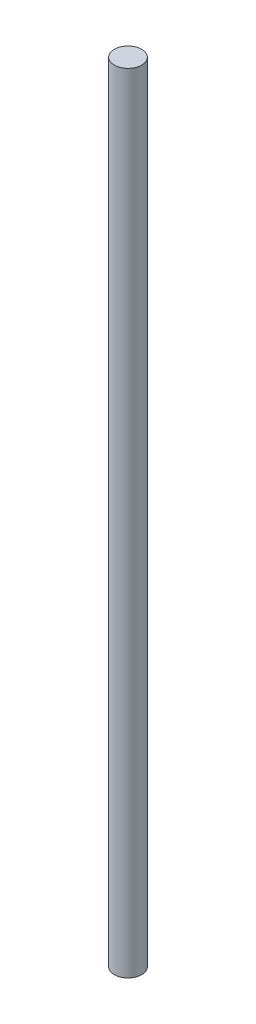
ISO-10303-21;
HEADER;
FILE_DESCRIPTION(('STEP AP214'),'2;1');
FILE_NAME('part.step','',(''),(''),'','','');
FILE_SCHEMA(('AUTOMOTIVE_DESIGN { 1 0 10303 214 1 1 1 1 }'));
ENDSEC;
DATA;
#1=APPLICATION_CONTEXT('core data for automotive mechanical design processes');
#2=APPLICATION_PROTOCOL_DEFINITION('international standard','automotive_design',2000,#1);
#3=PRODUCT_CONTEXT('',#1,'mechanical');
#4=PRODUCT('Part','Part','',(#3));
#5=PRODUCT_RELATED_PRODUCT_CATEGORY('part','',(#4));
#6=PRODUCT_DEFINITION_FORMATION('','',#4);
#7=PRODUCT_DEFINITION_CONTEXT('part definition',#1,'design');
#8=PRODUCT_DEFINITION('design','',#6,#7);
#9=PRODUCT_DEFINITION_SHAPE('','',#8);
#10=(LENGTH_UNIT() NAMED_UNIT(*) SI_UNIT(.MILLI.,.METRE.));
#11=(NAMED_UNIT(*) PLANE_ANGLE_UNIT() SI_UNIT($,.RADIAN.));
#12=(NAMED_UNIT(*) SI_UNIT($,.STERADIAN.) SOLID_ANGLE_UNIT());
#13=UNCERTAINTY_MEASURE_WITH_UNIT(LENGTH_MEASURE(1.E-05),#10,'distance_accuracy_value','');
#14=(GEOMETRIC_REPRESENTATION_CONTEXT(3) GLOBAL_UNCERTAINTY_ASSIGNED_CONTEXT((#13)) GLOBAL_UNIT_ASSIGNED_CONTEXT((#10,
#11,#12)) REPRESENTATION_CONTEXT('',''));
#15=CARTESIAN_POINT('',(0.,0.,0.));
#16=DIRECTION('',(0.,0.,1.));
#17=DIRECTION('',(1.,0.,0.));
#18=AXIS2_PLACEMENT_3D('',#15,#16,#17);
#19=CARTESIAN_POINT('',(0.,230.,0.));
#20=DIRECTION('',(0.,-1.,0.));
#21=DIRECTION('',(0.,0.,-1.));
#22=AXIS2_PLACEMENT_3D('',#19,#20,#21);
#23=CYLINDRICAL_SURFACE('',#22,4.);
#24=CARTESIAN_POINT('',(0.,230.,0.));
#25=DIRECTION('',(0.,1.,0.));
#26=DIRECTION('',(0.,0.,1.));
#27=AXIS2_PLACEMENT_3D('',#24,#25,#26);
#28=CIRCLE('',#27,4.);
#29=CARTESIAN_POINT('',(0.,230.,4.));
#30=VERTEX_POINT('',#29);
#31=EDGE_CURVE('E10',#30,#30,#28,.T.);
#32=ORIENTED_EDGE('',*,*,#31,.F.);
#33=EDGE_LOOP('',(#32));
#34=FACE_BOUND('',#33,.T.);
#35=CARTESIAN_POINT('',(0.,0.,0.));
#36=DIRECTION('',(0.,1.,0.));
#37=DIRECTION('',(0.,0.,1.));
#38=AXIS2_PLACEMENT_3D('',#35,#36,#37);
#39=CIRCLE('',#38,4.);
#40=CARTESIAN_POINT('',(0.,0.,4.));
#41=VERTEX_POINT('',#40);
#42=EDGE_CURVE('E35',#41,#41,#39,.T.);
#43=ORIENTED_EDGE('',*,*,#42,.T.);
#44=EDGE_LOOP('',(#43));
#45=FACE_BOUND('',#44,.T.);
#46=ADVANCED_FACE('F32',(#34,#45),#23,.T.);
#47=CARTESIAN_POINT('',(0.,230.,0.));
#48=DIRECTION('',(0.,1.,0.));
#49=DIRECTION('',(0.,0.,1.));
#50=AXIS2_PLACEMENT_3D('',#47,#48,#49);
#51=PLANE('',#50);
#52=ORIENTED_EDGE('',*,*,#31,.T.);
#53=EDGE_LOOP('',(#52));
#54=FACE_BOUND('',#53,.T.);
#55=ADVANCED_FACE('F47',(#54),#51,.T.);
#56=CARTESIAN_POINT('',(0.,0.,0.));
#57=DIRECTION('',(0.,1.,0.));
#58=DIRECTION('',(0.,0.,1.));
#59=AXIS2_PLACEMENT_3D('',#56,#57,#58);
#60=PLANE('',#59);
#61=ORIENTED_EDGE('',*,*,#42,.F.);
#62=EDGE_LOOP('',(#61));
#63=FACE_BOUND('',#62,.T.);
#64=ADVANCED_FACE('F45',(#63),#60,.F.);
#65=CLOSED_SHELL('',(#46,#55,#64));
#66=MANIFOLD_SOLID_BREP('B2',#65);
#67=ADVANCED_BREP_SHAPE_REPRESENTATION('',(#18,#66),#14);
#68=SHAPE_DEFINITION_REPRESENTATION(#9,#67);
ENDSEC;
END-ISO-10303-21;
